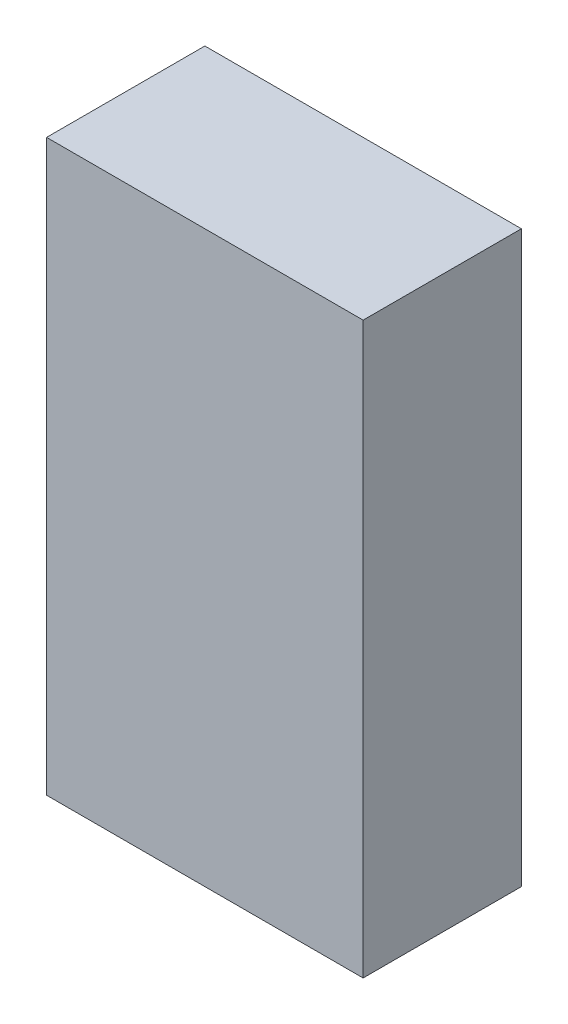
ISO-10303-21;
HEADER;
FILE_DESCRIPTION(('STEP AP214'),'2;1');
FILE_NAME('part.step','',(''),(''),'','','');
FILE_SCHEMA(('AUTOMOTIVE_DESIGN { 1 0 10303 214 1 1 1 1 }'));
ENDSEC;
DATA;
#1=APPLICATION_CONTEXT('core data for automotive mechanical design processes');
#2=APPLICATION_PROTOCOL_DEFINITION('international standard','automotive_design',2000,#1);
#3=PRODUCT_CONTEXT('',#1,'mechanical');
#4=PRODUCT('Part','Part','',(#3));
#5=PRODUCT_RELATED_PRODUCT_CATEGORY('part','',(#4));
#6=PRODUCT_DEFINITION_FORMATION('','',#4);
#7=PRODUCT_DEFINITION_CONTEXT('part definition',#1,'design');
#8=PRODUCT_DEFINITION('design','',#6,#7);
#9=PRODUCT_DEFINITION_SHAPE('','',#8);
#10=(LENGTH_UNIT() NAMED_UNIT(*) SI_UNIT(.MILLI.,.METRE.));
#11=(NAMED_UNIT(*) PLANE_ANGLE_UNIT() SI_UNIT($,.RADIAN.));
#12=(NAMED_UNIT(*) SI_UNIT($,.STERADIAN.) SOLID_ANGLE_UNIT());
#13=UNCERTAINTY_MEASURE_WITH_UNIT(LENGTH_MEASURE(1.E-05),#10,'distance_accuracy_value','');
#14=(GEOMETRIC_REPRESENTATION_CONTEXT(3) GLOBAL_UNCERTAINTY_ASSIGNED_CONTEXT((#13)) GLOBAL_UNIT_ASSIGNED_CONTEXT((#10,
#11,#12)) REPRESENTATION_CONTEXT('',''));
#15=CARTESIAN_POINT('',(0.,0.,0.));
#16=DIRECTION('',(0.,0.,1.));
#17=DIRECTION('',(1.,0.,0.));
#18=AXIS2_PLACEMENT_3D('',#15,#16,#17);
#19=CARTESIAN_POINT('',(5.,8.99999999999999,5.));
#20=DIRECTION('',(-1.,0.,0.));
#21=DIRECTION('',(0.,-1.,0.));
#22=AXIS2_PLACEMENT_3D('',#19,#20,#21);
#23=PLANE('',#22);
#24=DIRECTION('',(0.,1.,0.));
#25=VECTOR('',#24,1.);
#26=CARTESIAN_POINT('',(5.,8.99999999999999,0.));
#27=LINE('',#26,#25);
#28=CARTESIAN_POINT('',(5.,-9.00000000000001,0.));
#29=VERTEX_POINT('',#28);
#30=CARTESIAN_POINT('',(5.,8.99999999999999,0.));
#31=VERTEX_POINT('',#30);
#32=EDGE_CURVE('E98',#29,#31,#27,.T.);
#33=ORIENTED_EDGE('',*,*,#32,.T.);
#34=DIRECTION('',(0.,0.,-1.));
#35=VECTOR('',#34,1.);
#36=CARTESIAN_POINT('',(5.,8.99999999999999,5.));
#37=LINE('',#36,#35);
#38=CARTESIAN_POINT('',(5.,8.99999999999999,5.));
#39=VERTEX_POINT('',#38);
#40=EDGE_CURVE('E11',#39,#31,#37,.T.);
#41=ORIENTED_EDGE('',*,*,#40,.F.);
#42=DIRECTION('',(0.,1.,0.));
#43=VECTOR('',#42,1.);
#44=CARTESIAN_POINT('',(5.,8.99999999999999,5.));
#45=LINE('',#44,#43);
#46=CARTESIAN_POINT('',(5.,-9.00000000000001,5.));
#47=VERTEX_POINT('',#46);
#48=EDGE_CURVE('E86',#47,#39,#45,.T.);
#49=ORIENTED_EDGE('',*,*,#48,.F.);
#50=DIRECTION('',(0.,0.,-1.));
#51=VECTOR('',#50,1.);
#52=CARTESIAN_POINT('',(5.,-9.00000000000001,5.));
#53=LINE('',#52,#51);
#54=EDGE_CURVE('E94',#47,#29,#53,.T.);
#55=ORIENTED_EDGE('',*,*,#54,.T.);
#56=EDGE_LOOP('',(#33,#41,#49,#55));
#57=FACE_BOUND('',#56,.T.);
#58=ADVANCED_FACE('F35',(#57),#23,.F.);
#59=CARTESIAN_POINT('',(-4.99999999999999,8.99999999999999,5.));
#60=DIRECTION('',(0.,-1.,0.));
#61=DIRECTION('',(0.,0.,-1.));
#62=AXIS2_PLACEMENT_3D('',#59,#60,#61);
#63=PLANE('',#62);
#64=DIRECTION('',(-1.,0.,0.));
#65=VECTOR('',#64,1.);
#66=CARTESIAN_POINT('',(-4.99999999999999,8.99999999999999,0.));
#67=LINE('',#66,#65);
#68=CARTESIAN_POINT('',(-4.99999999999999,8.99999999999999,0.));
#69=VERTEX_POINT('',#68);
#70=EDGE_CURVE('E90',#31,#69,#67,.T.);
#71=ORIENTED_EDGE('',*,*,#70,.T.);
#72=DIRECTION('',(0.,0.,-1.));
#73=VECTOR('',#72,1.);
#74=CARTESIAN_POINT('',(-4.99999999999999,8.99999999999999,5.));
#75=LINE('',#74,#73);
#76=CARTESIAN_POINT('',(-4.99999999999999,8.99999999999999,5.));
#77=VERTEX_POINT('',#76);
#78=EDGE_CURVE('E43',#77,#69,#75,.T.);
#79=ORIENTED_EDGE('',*,*,#78,.F.);
#80=DIRECTION('',(-1.,0.,0.));
#81=VECTOR('',#80,1.);
#82=CARTESIAN_POINT('',(-4.99999999999999,8.99999999999999,5.));
#83=LINE('',#82,#81);
#84=EDGE_CURVE('E81',#39,#77,#83,.T.);
#85=ORIENTED_EDGE('',*,*,#84,.F.);
#86=ORIENTED_EDGE('',*,*,#40,.T.);
#87=EDGE_LOOP('',(#71,#79,#85,#86));
#88=FACE_BOUND('',#87,.T.);
#89=ADVANCED_FACE('F89',(#88),#63,.F.);
#90=CARTESIAN_POINT('',(-4.99999999999999,8.99999999999999,5.));
#91=DIRECTION('',(1.,0.,0.));
#92=DIRECTION('',(0.,0.,-1.));
#93=AXIS2_PLACEMENT_3D('',#90,#91,#92);
#94=PLANE('',#93);
#95=DIRECTION('',(0.,-1.,0.));
#96=VECTOR('',#95,1.);
#97=CARTESIAN_POINT('',(-4.99999999999999,8.99999999999999,0.));
#98=LINE('',#97,#96);
#99=CARTESIAN_POINT('',(-4.99999999999999,-9.00000000000001,0.));
#100=VERTEX_POINT('',#99);
#101=EDGE_CURVE('E68',#69,#100,#98,.T.);
#102=ORIENTED_EDGE('',*,*,#101,.T.);
#103=DIRECTION('',(0.,0.,-1.));
#104=VECTOR('',#103,1.);
#105=CARTESIAN_POINT('',(-4.99999999999999,-9.00000000000001,5.));
#106=LINE('',#105,#104);
#107=CARTESIAN_POINT('',(-4.99999999999999,-9.00000000000001,5.));
#108=VERTEX_POINT('',#107);
#109=EDGE_CURVE('E91',#108,#100,#106,.T.);
#110=ORIENTED_EDGE('',*,*,#109,.F.);
#111=DIRECTION('',(0.,-1.,0.));
#112=VECTOR('',#111,1.);
#113=CARTESIAN_POINT('',(-4.99999999999999,8.99999999999999,5.));
#114=LINE('',#113,#112);
#115=EDGE_CURVE('E84',#77,#108,#114,.T.);
#116=ORIENTED_EDGE('',*,*,#115,.F.);
#117=ORIENTED_EDGE('',*,*,#78,.T.);
#118=EDGE_LOOP('',(#102,#110,#116,#117));
#119=FACE_BOUND('',#118,.T.);
#120=ADVANCED_FACE('F92',(#119),#94,.F.);
#121=CARTESIAN_POINT('',(-4.99999999999999,-9.00000000000001,5.));
#122=DIRECTION('',(0.,1.,0.));
#123=DIRECTION('',(0.,0.,1.));
#124=AXIS2_PLACEMENT_3D('',#121,#122,#123);
#125=PLANE('',#124);
#126=DIRECTION('',(1.,0.,0.));
#127=VECTOR('',#126,1.);
#128=CARTESIAN_POINT('',(-4.99999999999999,-9.00000000000001,0.));
#129=LINE('',#128,#127);
#130=EDGE_CURVE('E74',#100,#29,#129,.T.);
#131=ORIENTED_EDGE('',*,*,#130,.T.);
#132=ORIENTED_EDGE('',*,*,#54,.F.);
#133=DIRECTION('',(1.,0.,0.));
#134=VECTOR('',#133,1.);
#135=CARTESIAN_POINT('',(-4.99999999999999,-9.00000000000001,5.));
#136=LINE('',#135,#134);
#137=EDGE_CURVE('E51',#108,#47,#136,.T.);
#138=ORIENTED_EDGE('',*,*,#137,.F.);
#139=ORIENTED_EDGE('',*,*,#109,.T.);
#140=EDGE_LOOP('',(#131,#132,#138,#139));
#141=FACE_BOUND('',#140,.T.);
#142=ADVANCED_FACE('F105',(#141),#125,.F.);
#143=CARTESIAN_POINT('',(0.,0.,5.));
#144=DIRECTION('',(0.,0.,1.));
#145=DIRECTION('',(1.,0.,0.));
#146=AXIS2_PLACEMENT_3D('',#143,#144,#145);
#147=PLANE('',#146);
#148=ORIENTED_EDGE('',*,*,#48,.T.);
#149=ORIENTED_EDGE('',*,*,#84,.T.);
#150=ORIENTED_EDGE('',*,*,#115,.T.);
#151=ORIENTED_EDGE('',*,*,#137,.T.);
#152=EDGE_LOOP('',(#148,#149,#150,#151));
#153=FACE_BOUND('',#152,.T.);
#154=ADVANCED_FACE('F82',(#153),#147,.T.);
#155=CARTESIAN_POINT('',(0.,0.,0.));
#156=DIRECTION('',(0.,0.,1.));
#157=DIRECTION('',(1.,0.,0.));
#158=AXIS2_PLACEMENT_3D('',#155,#156,#157);
#159=PLANE('',#158);
#160=ORIENTED_EDGE('',*,*,#32,.F.);
#161=ORIENTED_EDGE('',*,*,#130,.F.);
#162=ORIENTED_EDGE('',*,*,#101,.F.);
#163=ORIENTED_EDGE('',*,*,#70,.F.);
#164=EDGE_LOOP('',(#160,#161,#162,#163));
#165=FACE_BOUND('',#164,.T.);
#166=ADVANCED_FACE('F108',(#165),#159,.F.);
#167=CLOSED_SHELL('',(#58,#89,#120,#142,#154,#166));
#168=MANIFOLD_SOLID_BREP('B2',#167);
#169=ADVANCED_BREP_SHAPE_REPRESENTATION('',(#18,#168),#14);
#170=SHAPE_DEFINITION_REPRESENTATION(#9,#169);
ENDSEC;
END-ISO-10303-21;
